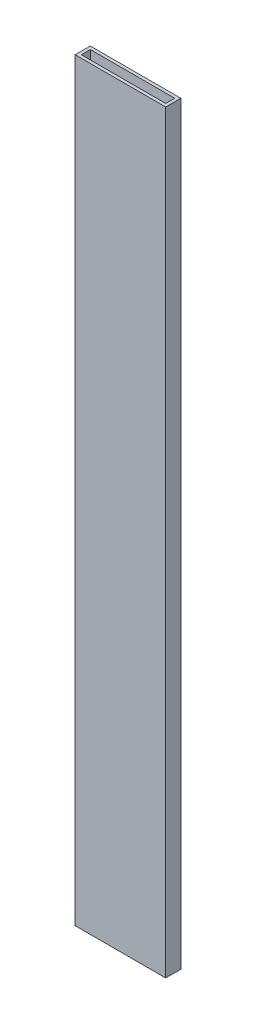
ISO-10303-21;
HEADER;
FILE_DESCRIPTION(('STEP AP214'),'2;1');
FILE_NAME('part.step','',(''),(''),'','','');
FILE_SCHEMA(('AUTOMOTIVE_DESIGN { 1 0 10303 214 1 1 1 1 }'));
ENDSEC;
DATA;
#1=APPLICATION_CONTEXT('core data for automotive mechanical design processes');
#2=APPLICATION_PROTOCOL_DEFINITION('international standard','automotive_design',2000,#1);
#3=PRODUCT_CONTEXT('',#1,'mechanical');
#4=PRODUCT('Part','Part','',(#3));
#5=PRODUCT_RELATED_PRODUCT_CATEGORY('part','',(#4));
#6=PRODUCT_DEFINITION_FORMATION('','',#4);
#7=PRODUCT_DEFINITION_CONTEXT('part definition',#1,'design');
#8=PRODUCT_DEFINITION('design','',#6,#7);
#9=PRODUCT_DEFINITION_SHAPE('','',#8);
#10=(LENGTH_UNIT() NAMED_UNIT(*) SI_UNIT(.MILLI.,.METRE.));
#11=(NAMED_UNIT(*) PLANE_ANGLE_UNIT() SI_UNIT($,.RADIAN.));
#12=(NAMED_UNIT(*) SI_UNIT($,.STERADIAN.) SOLID_ANGLE_UNIT());
#13=UNCERTAINTY_MEASURE_WITH_UNIT(LENGTH_MEASURE(1.E-05),#10,'distance_accuracy_value','');
#14=(GEOMETRIC_REPRESENTATION_CONTEXT(3) GLOBAL_UNCERTAINTY_ASSIGNED_CONTEXT((#13)) GLOBAL_UNIT_ASSIGNED_CONTEXT((#10,
#11,#12)) REPRESENTATION_CONTEXT('',''));
#15=CARTESIAN_POINT('',(0.,0.,0.));
#16=DIRECTION('',(0.,0.,1.));
#17=DIRECTION('',(1.,0.,0.));
#18=AXIS2_PLACEMENT_3D('',#15,#16,#17);
#19=CARTESIAN_POINT('',(0.,500.,0.));
#20=DIRECTION('',(0.,-1.,0.));
#21=DIRECTION('',(0.,0.,-1.));
#22=AXIS2_PLACEMENT_3D('',#19,#20,#21);
#23=PLANE('',#22);
#24=DIRECTION('',(0.,0.,1.));
#25=VECTOR('',#24,1.);
#26=CARTESIAN_POINT('',(0.,500.,0.));
#27=LINE('',#26,#25);
#28=CARTESIAN_POINT('',(0.,500.,-10.));
#29=VERTEX_POINT('',#28);
#30=CARTESIAN_POINT('',(0.,500.,0.));
#31=VERTEX_POINT('',#30);
#32=EDGE_CURVE('E136',#29,#31,#27,.T.);
#33=ORIENTED_EDGE('',*,*,#32,.T.);
#34=DIRECTION('',(1.,0.,0.));
#35=VECTOR('',#34,1.);
#36=CARTESIAN_POINT('',(0.,500.,0.));
#37=LINE('',#36,#35);
#38=CARTESIAN_POINT('',(60.,500.,0.));
#39=VERTEX_POINT('',#38);
#40=EDGE_CURVE('E139',#31,#39,#37,.T.);
#41=ORIENTED_EDGE('',*,*,#40,.T.);
#42=DIRECTION('',(0.,0.,-1.));
#43=VECTOR('',#42,1.);
#44=CARTESIAN_POINT('',(60.,500.,0.));
#45=LINE('',#44,#43);
#46=CARTESIAN_POINT('',(60.,500.,-10.));
#47=VERTEX_POINT('',#46);
#48=EDGE_CURVE('E142',#39,#47,#45,.T.);
#49=ORIENTED_EDGE('',*,*,#48,.T.);
#50=DIRECTION('',(-1.,0.,0.));
#51=VECTOR('',#50,1.);
#52=CARTESIAN_POINT('',(0.,500.,-10.));
#53=LINE('',#52,#51);
#54=EDGE_CURVE('E144',#47,#29,#53,.T.);
#55=ORIENTED_EDGE('',*,*,#54,.T.);
#56=EDGE_LOOP('',(#33,#41,#49,#55));
#57=FACE_BOUND('',#56,.T.);
#58=DIRECTION('',(1.,0.,0.));
#59=VECTOR('',#58,1.);
#60=CARTESIAN_POINT('',(2.,500.,-2.));
#61=LINE('',#60,#59);
#62=CARTESIAN_POINT('',(2.,500.,-2.));
#63=VERTEX_POINT('',#62);
#64=CARTESIAN_POINT('',(58.,500.,-2.));
#65=VERTEX_POINT('',#64);
#66=EDGE_CURVE('E100',#63,#65,#61,.T.);
#67=ORIENTED_EDGE('',*,*,#66,.F.);
#68=DIRECTION('',(0.,0.,1.));
#69=VECTOR('',#68,1.);
#70=CARTESIAN_POINT('',(2.,500.,-2.));
#71=LINE('',#70,#69);
#72=CARTESIAN_POINT('',(2.,500.,-8.));
#73=VERTEX_POINT('',#72);
#74=EDGE_CURVE('E122',#73,#63,#71,.T.);
#75=ORIENTED_EDGE('',*,*,#74,.F.);
#76=DIRECTION('',(-1.,0.,0.));
#77=VECTOR('',#76,1.);
#78=CARTESIAN_POINT('',(2.,500.,-8.));
#79=LINE('',#78,#77);
#80=CARTESIAN_POINT('',(58.,500.,-8.));
#81=VERTEX_POINT('',#80);
#82=EDGE_CURVE('E120',#81,#73,#79,.T.);
#83=ORIENTED_EDGE('',*,*,#82,.F.);
#84=DIRECTION('',(0.,0.,-1.));
#85=VECTOR('',#84,1.);
#86=CARTESIAN_POINT('',(58.,500.,-2.));
#87=LINE('',#86,#85);
#88=EDGE_CURVE('E108',#65,#81,#87,.T.);
#89=ORIENTED_EDGE('',*,*,#88,.F.);
#90=EDGE_LOOP('',(#67,#75,#83,#89));
#91=FACE_BOUND('',#90,.T.);
#92=ADVANCED_FACE('F35',(#57,#91),#23,.F.);
#93=CARTESIAN_POINT('',(0.,0.,0.));
#94=DIRECTION('',(0.,-1.,0.));
#95=DIRECTION('',(0.,0.,-1.));
#96=AXIS2_PLACEMENT_3D('',#93,#94,#95);
#97=PLANE('',#96);
#98=DIRECTION('',(0.,0.,1.));
#99=VECTOR('',#98,1.);
#100=CARTESIAN_POINT('',(0.,0.,0.));
#101=LINE('',#100,#99);
#102=CARTESIAN_POINT('',(0.,0.,-10.));
#103=VERTEX_POINT('',#102);
#104=CARTESIAN_POINT('',(0.,0.,0.));
#105=VERTEX_POINT('',#104);
#106=EDGE_CURVE('E116',#103,#105,#101,.T.);
#107=ORIENTED_EDGE('',*,*,#106,.F.);
#108=DIRECTION('',(-1.,0.,0.));
#109=VECTOR('',#108,1.);
#110=CARTESIAN_POINT('',(0.,0.,-10.));
#111=LINE('',#110,#109);
#112=CARTESIAN_POINT('',(60.,0.,-10.));
#113=VERTEX_POINT('',#112);
#114=EDGE_CURVE('E140',#113,#103,#111,.T.);
#115=ORIENTED_EDGE('',*,*,#114,.F.);
#116=DIRECTION('',(0.,0.,-1.));
#117=VECTOR('',#116,1.);
#118=CARTESIAN_POINT('',(60.,0.,0.));
#119=LINE('',#118,#117);
#120=CARTESIAN_POINT('',(60.,0.,0.));
#121=VERTEX_POINT('',#120);
#122=EDGE_CURVE('E151',#121,#113,#119,.T.);
#123=ORIENTED_EDGE('',*,*,#122,.F.);
#124=DIRECTION('',(1.,0.,0.));
#125=VECTOR('',#124,1.);
#126=CARTESIAN_POINT('',(0.,0.,0.));
#127=LINE('',#126,#125);
#128=EDGE_CURVE('E149',#105,#121,#127,.T.);
#129=ORIENTED_EDGE('',*,*,#128,.F.);
#130=EDGE_LOOP('',(#107,#115,#123,#129));
#131=FACE_BOUND('',#130,.T.);
#132=DIRECTION('',(0.,0.,1.));
#133=VECTOR('',#132,1.);
#134=CARTESIAN_POINT('',(2.,0.,-2.));
#135=LINE('',#134,#133);
#136=CARTESIAN_POINT('',(2.,0.,-8.));
#137=VERTEX_POINT('',#136);
#138=CARTESIAN_POINT('',(2.,0.,-2.));
#139=VERTEX_POINT('',#138);
#140=EDGE_CURVE('E109',#137,#139,#135,.T.);
#141=ORIENTED_EDGE('',*,*,#140,.T.);
#142=DIRECTION('',(1.,0.,0.));
#143=VECTOR('',#142,1.);
#144=CARTESIAN_POINT('',(2.,0.,-2.));
#145=LINE('',#144,#143);
#146=CARTESIAN_POINT('',(58.,0.,-2.));
#147=VERTEX_POINT('',#146);
#148=EDGE_CURVE('E58',#139,#147,#145,.T.);
#149=ORIENTED_EDGE('',*,*,#148,.T.);
#150=DIRECTION('',(0.,0.,-1.));
#151=VECTOR('',#150,1.);
#152=CARTESIAN_POINT('',(58.,0.,-2.));
#153=LINE('',#152,#151);
#154=CARTESIAN_POINT('',(58.,0.,-8.));
#155=VERTEX_POINT('',#154);
#156=EDGE_CURVE('E115',#147,#155,#153,.T.);
#157=ORIENTED_EDGE('',*,*,#156,.T.);
#158=DIRECTION('',(-1.,0.,0.));
#159=VECTOR('',#158,1.);
#160=CARTESIAN_POINT('',(2.,0.,-8.));
#161=LINE('',#160,#159);
#162=EDGE_CURVE('E128',#155,#137,#161,.T.);
#163=ORIENTED_EDGE('',*,*,#162,.T.);
#164=EDGE_LOOP('',(#141,#149,#157,#163));
#165=FACE_BOUND('',#164,.T.);
#166=ADVANCED_FACE('F169',(#131,#165),#97,.T.);
#167=CARTESIAN_POINT('',(0.,500.,0.));
#168=DIRECTION('',(1.,0.,0.));
#169=DIRECTION('',(0.,0.,-1.));
#170=AXIS2_PLACEMENT_3D('',#167,#168,#169);
#171=PLANE('',#170);
#172=ORIENTED_EDGE('',*,*,#106,.T.);
#173=DIRECTION('',(0.,-1.,0.));
#174=VECTOR('',#173,1.);
#175=CARTESIAN_POINT('',(0.,500.,0.));
#176=LINE('',#175,#174);
#177=EDGE_CURVE('E11',#31,#105,#176,.T.);
#178=ORIENTED_EDGE('',*,*,#177,.F.);
#179=ORIENTED_EDGE('',*,*,#32,.F.);
#180=DIRECTION('',(0.,-1.,0.));
#181=VECTOR('',#180,1.);
#182=CARTESIAN_POINT('',(0.,500.,-10.));
#183=LINE('',#182,#181);
#184=EDGE_CURVE('E146',#29,#103,#183,.T.);
#185=ORIENTED_EDGE('',*,*,#184,.T.);
#186=EDGE_LOOP('',(#172,#178,#179,#185));
#187=FACE_BOUND('',#186,.T.);
#188=ADVANCED_FACE('F37',(#187),#171,.F.);
#189=CARTESIAN_POINT('',(0.,500.,0.));
#190=DIRECTION('',(0.,0.,-1.));
#191=DIRECTION('',(-1.,0.,0.));
#192=AXIS2_PLACEMENT_3D('',#189,#190,#191);
#193=PLANE('',#192);
#194=ORIENTED_EDGE('',*,*,#128,.T.);
#195=DIRECTION('',(0.,-1.,0.));
#196=VECTOR('',#195,1.);
#197=CARTESIAN_POINT('',(60.,500.,0.));
#198=LINE('',#197,#196);
#199=EDGE_CURVE('E43',#39,#121,#198,.T.);
#200=ORIENTED_EDGE('',*,*,#199,.F.);
#201=ORIENTED_EDGE('',*,*,#40,.F.);
#202=ORIENTED_EDGE('',*,*,#177,.T.);
#203=EDGE_LOOP('',(#194,#200,#201,#202));
#204=FACE_BOUND('',#203,.T.);
#205=ADVANCED_FACE('F179',(#204),#193,.F.);
#206=CARTESIAN_POINT('',(60.,500.,0.));
#207=DIRECTION('',(-1.,0.,0.));
#208=DIRECTION('',(0.,0.,1.));
#209=AXIS2_PLACEMENT_3D('',#206,#207,#208);
#210=PLANE('',#209);
#211=ORIENTED_EDGE('',*,*,#122,.T.);
#212=DIRECTION('',(0.,-1.,0.));
#213=VECTOR('',#212,1.);
#214=CARTESIAN_POINT('',(60.,500.,-10.));
#215=LINE('',#214,#213);
#216=EDGE_CURVE('E156',#47,#113,#215,.T.);
#217=ORIENTED_EDGE('',*,*,#216,.F.);
#218=ORIENTED_EDGE('',*,*,#48,.F.);
#219=ORIENTED_EDGE('',*,*,#199,.T.);
#220=EDGE_LOOP('',(#211,#217,#218,#219));
#221=FACE_BOUND('',#220,.T.);
#222=ADVANCED_FACE('F163',(#221),#210,.F.);
#223=CARTESIAN_POINT('',(0.,500.,-10.));
#224=DIRECTION('',(0.,0.,1.));
#225=DIRECTION('',(1.,0.,0.));
#226=AXIS2_PLACEMENT_3D('',#223,#224,#225);
#227=PLANE('',#226);
#228=ORIENTED_EDGE('',*,*,#114,.T.);
#229=ORIENTED_EDGE('',*,*,#184,.F.);
#230=ORIENTED_EDGE('',*,*,#54,.F.);
#231=ORIENTED_EDGE('',*,*,#216,.T.);
#232=EDGE_LOOP('',(#228,#229,#230,#231));
#233=FACE_BOUND('',#232,.T.);
#234=ADVANCED_FACE('F173',(#233),#227,.F.);
#235=CARTESIAN_POINT('',(2.,500.,-2.));
#236=DIRECTION('',(0.,0.,-1.));
#237=DIRECTION('',(-1.,0.,0.));
#238=AXIS2_PLACEMENT_3D('',#235,#236,#237);
#239=PLANE('',#238);
#240=ORIENTED_EDGE('',*,*,#148,.F.);
#241=DIRECTION('',(0.,-1.,0.));
#242=VECTOR('',#241,1.);
#243=CARTESIAN_POINT('',(2.,500.,-2.));
#244=LINE('',#243,#242);
#245=EDGE_CURVE('E104',#63,#139,#244,.T.);
#246=ORIENTED_EDGE('',*,*,#245,.F.);
#247=ORIENTED_EDGE('',*,*,#66,.T.);
#248=DIRECTION('',(0.,-1.,0.));
#249=VECTOR('',#248,1.);
#250=CARTESIAN_POINT('',(58.,500.,-2.));
#251=LINE('',#250,#249);
#252=EDGE_CURVE('E103',#65,#147,#251,.T.);
#253=ORIENTED_EDGE('',*,*,#252,.T.);
#254=EDGE_LOOP('',(#240,#246,#247,#253));
#255=FACE_BOUND('',#254,.T.);
#256=ADVANCED_FACE('F102',(#255),#239,.T.);
#257=CARTESIAN_POINT('',(58.,500.,-2.));
#258=DIRECTION('',(-1.,0.,0.));
#259=DIRECTION('',(0.,0.,1.));
#260=AXIS2_PLACEMENT_3D('',#257,#258,#259);
#261=PLANE('',#260);
#262=ORIENTED_EDGE('',*,*,#156,.F.);
#263=ORIENTED_EDGE('',*,*,#252,.F.);
#264=ORIENTED_EDGE('',*,*,#88,.T.);
#265=DIRECTION('',(0.,-1.,0.));
#266=VECTOR('',#265,1.);
#267=CARTESIAN_POINT('',(58.,500.,-8.));
#268=LINE('',#267,#266);
#269=EDGE_CURVE('E117',#81,#155,#268,.T.);
#270=ORIENTED_EDGE('',*,*,#269,.T.);
#271=EDGE_LOOP('',(#262,#263,#264,#270));
#272=FACE_BOUND('',#271,.T.);
#273=ADVANCED_FACE('F112',(#272),#261,.T.);
#274=CARTESIAN_POINT('',(2.,500.,-8.));
#275=DIRECTION('',(0.,0.,1.));
#276=DIRECTION('',(1.,0.,0.));
#277=AXIS2_PLACEMENT_3D('',#274,#275,#276);
#278=PLANE('',#277);
#279=ORIENTED_EDGE('',*,*,#162,.F.);
#280=ORIENTED_EDGE('',*,*,#269,.F.);
#281=ORIENTED_EDGE('',*,*,#82,.T.);
#282=DIRECTION('',(0.,-1.,0.));
#283=VECTOR('',#282,1.);
#284=CARTESIAN_POINT('',(2.,500.,-8.));
#285=LINE('',#284,#283);
#286=EDGE_CURVE('E50',#73,#137,#285,.T.);
#287=ORIENTED_EDGE('',*,*,#286,.T.);
#288=EDGE_LOOP('',(#279,#280,#281,#287));
#289=FACE_BOUND('',#288,.T.);
#290=ADVANCED_FACE('F202',(#289),#278,.T.);
#291=CARTESIAN_POINT('',(2.,500.,-2.));
#292=DIRECTION('',(1.,0.,0.));
#293=DIRECTION('',(0.,0.,-1.));
#294=AXIS2_PLACEMENT_3D('',#291,#292,#293);
#295=PLANE('',#294);
#296=ORIENTED_EDGE('',*,*,#140,.F.);
#297=ORIENTED_EDGE('',*,*,#286,.F.);
#298=ORIENTED_EDGE('',*,*,#74,.T.);
#299=ORIENTED_EDGE('',*,*,#245,.T.);
#300=EDGE_LOOP('',(#296,#297,#298,#299));
#301=FACE_BOUND('',#300,.T.);
#302=ADVANCED_FACE('F206',(#301),#295,.T.);
#303=CLOSED_SHELL('',(#92,#166,#188,#205,#222,#234,#256,#273,#290,#302));
#304=MANIFOLD_SOLID_BREP('B2',#303);
#305=ADVANCED_BREP_SHAPE_REPRESENTATION('',(#18,#304),#14);
#306=SHAPE_DEFINITION_REPRESENTATION(#9,#305);
ENDSEC;
END-ISO-10303-21;
